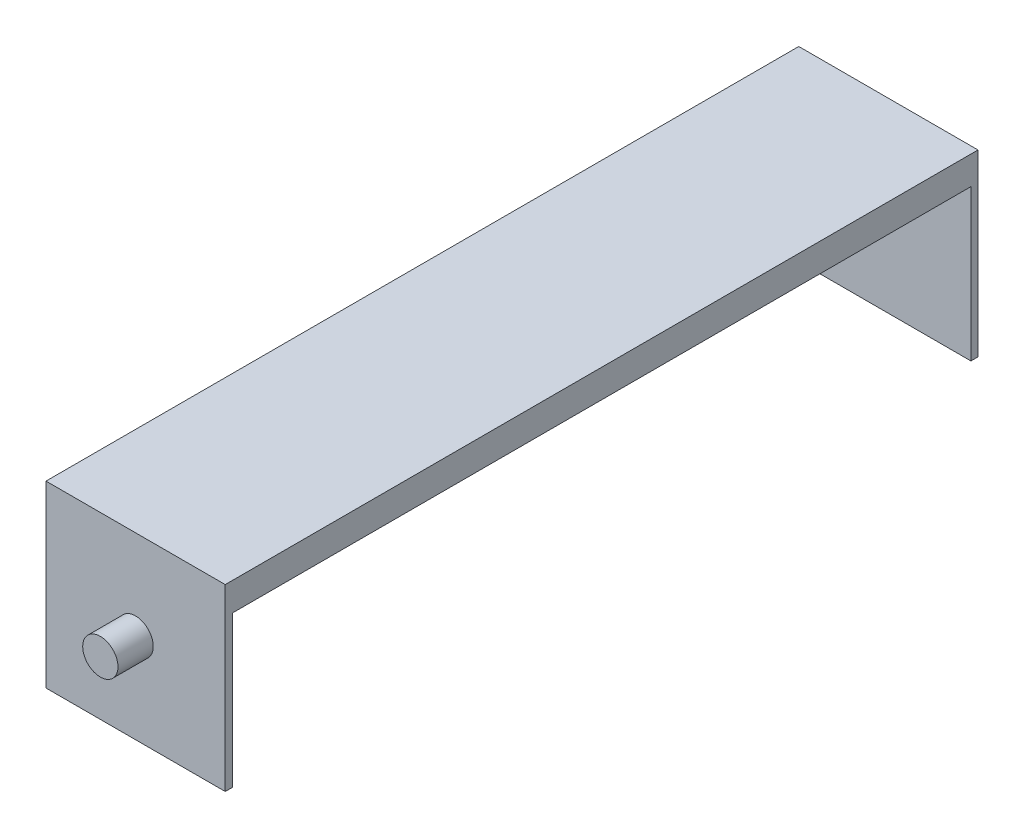
ISO-10303-21;
HEADER;
FILE_DESCRIPTION(('STEP AP214'),'2;1');
FILE_NAME('part.step','',(''),(''),'','','');
FILE_SCHEMA(('AUTOMOTIVE_DESIGN { 1 0 10303 214 1 1 1 1 }'));
ENDSEC;
DATA;
#1=APPLICATION_CONTEXT('core data for automotive mechanical design processes');
#2=APPLICATION_PROTOCOL_DEFINITION('international standard','automotive_design',2000,#1);
#3=PRODUCT_CONTEXT('',#1,'mechanical');
#4=PRODUCT('Part','Part','',(#3));
#5=PRODUCT_RELATED_PRODUCT_CATEGORY('part','',(#4));
#6=PRODUCT_DEFINITION_FORMATION('','',#4);
#7=PRODUCT_DEFINITION_CONTEXT('part definition',#1,'design');
#8=PRODUCT_DEFINITION('design','',#6,#7);
#9=PRODUCT_DEFINITION_SHAPE('','',#8);
#10=(LENGTH_UNIT() NAMED_UNIT(*) SI_UNIT(.MILLI.,.METRE.));
#11=(NAMED_UNIT(*) PLANE_ANGLE_UNIT() SI_UNIT($,.RADIAN.));
#12=(NAMED_UNIT(*) SI_UNIT($,.STERADIAN.) SOLID_ANGLE_UNIT());
#13=UNCERTAINTY_MEASURE_WITH_UNIT(LENGTH_MEASURE(1.E-05),#10,'distance_accuracy_value','');
#14=(GEOMETRIC_REPRESENTATION_CONTEXT(3) GLOBAL_UNCERTAINTY_ASSIGNED_CONTEXT((#13)) GLOBAL_UNIT_ASSIGNED_CONTEXT((#10,
#11,#12)) REPRESENTATION_CONTEXT('',''));
#15=CARTESIAN_POINT('',(0.,0.,0.));
#16=DIRECTION('',(0.,0.,1.));
#17=DIRECTION('',(1.,0.,0.));
#18=AXIS2_PLACEMENT_3D('',#15,#16,#17);
#19=CARTESIAN_POINT('',(-127.,-127.,533.4));
#20=DIRECTION('',(0.,1.,0.));
#21=DIRECTION('',(0.,0.,1.));
#22=AXIS2_PLACEMENT_3D('',#19,#20,#21);
#23=PLANE('',#22);
#24=DIRECTION('',(0.,0.,-1.));
#25=VECTOR('',#24,1.);
#26=CARTESIAN_POINT('',(127.,-127.,533.4));
#27=LINE('',#26,#25);
#28=CARTESIAN_POINT('',(127.,-127.,-523.4));
#29=VERTEX_POINT('',#28);
#30=CARTESIAN_POINT('',(127.,-127.,-533.4));
#31=VERTEX_POINT('',#30);
#32=EDGE_CURVE('E86',#29,#31,#27,.T.);
#33=ORIENTED_EDGE('',*,*,#32,.F.);
#34=DIRECTION('',(-1.,0.,0.));
#35=VECTOR('',#34,1.);
#36=CARTESIAN_POINT('',(-127.,-127.,-523.4));
#37=LINE('',#36,#35);
#38=CARTESIAN_POINT('',(-127.,-127.,-523.4));
#39=VERTEX_POINT('',#38);
#40=EDGE_CURVE('E11',#29,#39,#37,.T.);
#41=ORIENTED_EDGE('',*,*,#40,.T.);
#42=DIRECTION('',(0.,0.,-1.));
#43=VECTOR('',#42,1.);
#44=CARTESIAN_POINT('',(-127.,-127.,533.4));
#45=LINE('',#44,#43);
#46=CARTESIAN_POINT('',(-127.,-127.,-533.4));
#47=VERTEX_POINT('',#46);
#48=EDGE_CURVE('E163',#39,#47,#45,.T.);
#49=ORIENTED_EDGE('',*,*,#48,.T.);
#50=DIRECTION('',(1.,0.,0.));
#51=VECTOR('',#50,1.);
#52=CARTESIAN_POINT('',(-127.,-127.,-533.4));
#53=LINE('',#52,#51);
#54=EDGE_CURVE('E149',#47,#31,#53,.T.);
#55=ORIENTED_EDGE('',*,*,#54,.T.);
#56=EDGE_LOOP('',(#33,#41,#49,#55));
#57=FACE_BOUND('',#56,.T.);
#58=ADVANCED_FACE('F40',(#57),#23,.F.);
#59=CARTESIAN_POINT('',(127.,-127.,533.4));
#60=DIRECTION('',(-1.,0.,0.));
#61=DIRECTION('',(0.,0.,1.));
#62=AXIS2_PLACEMENT_3D('',#59,#60,#61);
#63=PLANE('',#62);
#64=DIRECTION('',(0.,0.,1.));
#65=VECTOR('',#64,1.);
#66=CARTESIAN_POINT('',(127.,87.,523.4));
#67=LINE('',#66,#65);
#68=CARTESIAN_POINT('',(127.,87.,-523.4));
#69=VERTEX_POINT('',#68);
#70=CARTESIAN_POINT('',(127.,87.,523.4));
#71=VERTEX_POINT('',#70);
#72=EDGE_CURVE('E121',#69,#71,#67,.T.);
#73=ORIENTED_EDGE('',*,*,#72,.F.);
#74=DIRECTION('',(0.,1.,0.));
#75=VECTOR('',#74,1.);
#76=CARTESIAN_POINT('',(127.,87.,-523.4));
#77=LINE('',#76,#75);
#78=EDGE_CURVE('E115',#29,#69,#77,.T.);
#79=ORIENTED_EDGE('',*,*,#78,.F.);
#80=ORIENTED_EDGE('',*,*,#32,.T.);
#81=DIRECTION('',(0.,1.,0.));
#82=VECTOR('',#81,1.);
#83=CARTESIAN_POINT('',(127.,-127.,-533.4));
#84=LINE('',#83,#82);
#85=CARTESIAN_POINT('',(127.,127.,-533.4));
#86=VERTEX_POINT('',#85);
#87=EDGE_CURVE('E146',#31,#86,#84,.T.);
#88=ORIENTED_EDGE('',*,*,#87,.T.);
#89=DIRECTION('',(0.,0.,-1.));
#90=VECTOR('',#89,1.);
#91=CARTESIAN_POINT('',(127.,127.,533.4));
#92=LINE('',#91,#90);
#93=CARTESIAN_POINT('',(127.,127.,533.4));
#94=VERTEX_POINT('',#93);
#95=EDGE_CURVE('E170',#94,#86,#92,.T.);
#96=ORIENTED_EDGE('',*,*,#95,.F.);
#97=DIRECTION('',(0.,1.,0.));
#98=VECTOR('',#97,1.);
#99=CARTESIAN_POINT('',(127.,-127.,533.4));
#100=LINE('',#99,#98);
#101=CARTESIAN_POINT('',(127.,-127.,533.4));
#102=VERTEX_POINT('',#101);
#103=EDGE_CURVE('E147',#102,#94,#100,.T.);
#104=ORIENTED_EDGE('',*,*,#103,.F.);
#105=CARTESIAN_POINT('',(127.,-127.,523.4));
#106=VERTEX_POINT('',#105);
#107=EDGE_CURVE('E161',#102,#106,#27,.T.);
#108=ORIENTED_EDGE('',*,*,#107,.T.);
#109=DIRECTION('',(0.,-1.,0.));
#110=VECTOR('',#109,1.);
#111=CARTESIAN_POINT('',(127.,87.,523.4));
#112=LINE('',#111,#110);
#113=EDGE_CURVE('E55',#71,#106,#112,.T.);
#114=ORIENTED_EDGE('',*,*,#113,.F.);
#115=EDGE_LOOP('',(#73,#79,#80,#88,#96,#104,#108,#114));
#116=FACE_BOUND('',#115,.T.);
#117=ADVANCED_FACE('F42',(#116),#63,.F.);
#118=CARTESIAN_POINT('',(-127.,127.,533.4));
#119=DIRECTION('',(0.,-1.,0.));
#120=DIRECTION('',(0.,0.,-1.));
#121=AXIS2_PLACEMENT_3D('',#118,#119,#120);
#122=PLANE('',#121);
#123=DIRECTION('',(-1.,0.,0.));
#124=VECTOR('',#123,1.);
#125=CARTESIAN_POINT('',(-127.,127.,-533.4));
#126=LINE('',#125,#124);
#127=CARTESIAN_POINT('',(-127.,127.,-533.4));
#128=VERTEX_POINT('',#127);
#129=EDGE_CURVE('E155',#86,#128,#126,.T.);
#130=ORIENTED_EDGE('',*,*,#129,.T.);
#131=DIRECTION('',(0.,0.,-1.));
#132=VECTOR('',#131,1.);
#133=CARTESIAN_POINT('',(-127.,127.,533.4));
#134=LINE('',#133,#132);
#135=CARTESIAN_POINT('',(-127.,127.,533.4));
#136=VERTEX_POINT('',#135);
#137=EDGE_CURVE('E167',#136,#128,#134,.T.);
#138=ORIENTED_EDGE('',*,*,#137,.F.);
#139=DIRECTION('',(-1.,0.,0.));
#140=VECTOR('',#139,1.);
#141=CARTESIAN_POINT('',(-127.,127.,533.4));
#142=LINE('',#141,#140);
#143=EDGE_CURVE('E94',#94,#136,#142,.T.);
#144=ORIENTED_EDGE('',*,*,#143,.F.);
#145=ORIENTED_EDGE('',*,*,#95,.T.);
#146=EDGE_LOOP('',(#130,#138,#144,#145));
#147=FACE_BOUND('',#146,.T.);
#148=ADVANCED_FACE('F185',(#147),#122,.F.);
#149=CARTESIAN_POINT('',(-127.,-127.,533.4));
#150=DIRECTION('',(1.,0.,0.));
#151=DIRECTION('',(0.,0.,-1.));
#152=AXIS2_PLACEMENT_3D('',#149,#150,#151);
#153=PLANE('',#152);
#154=ORIENTED_EDGE('',*,*,#48,.F.);
#155=DIRECTION('',(0.,-1.,0.));
#156=VECTOR('',#155,1.);
#157=CARTESIAN_POINT('',(-127.,87.,-523.4));
#158=LINE('',#157,#156);
#159=CARTESIAN_POINT('',(-127.,87.,-523.4));
#160=VERTEX_POINT('',#159);
#161=EDGE_CURVE('E140',#160,#39,#158,.T.);
#162=ORIENTED_EDGE('',*,*,#161,.F.);
#163=DIRECTION('',(0.,0.,-1.));
#164=VECTOR('',#163,1.);
#165=CARTESIAN_POINT('',(-127.,87.,523.4));
#166=LINE('',#165,#164);
#167=CARTESIAN_POINT('',(-127.,87.,523.4));
#168=VERTEX_POINT('',#167);
#169=EDGE_CURVE('E128',#168,#160,#166,.T.);
#170=ORIENTED_EDGE('',*,*,#169,.F.);
#171=DIRECTION('',(0.,1.,0.));
#172=VECTOR('',#171,1.);
#173=CARTESIAN_POINT('',(-127.,87.,523.4));
#174=LINE('',#173,#172);
#175=CARTESIAN_POINT('',(-127.,-127.,523.4));
#176=VERTEX_POINT('',#175);
#177=EDGE_CURVE('E136',#176,#168,#174,.T.);
#178=ORIENTED_EDGE('',*,*,#177,.F.);
#179=CARTESIAN_POINT('',(-127.,-127.,533.4));
#180=VERTEX_POINT('',#179);
#181=EDGE_CURVE('E164',#180,#176,#45,.T.);
#182=ORIENTED_EDGE('',*,*,#181,.F.);
#183=DIRECTION('',(0.,-1.,0.));
#184=VECTOR('',#183,1.);
#185=CARTESIAN_POINT('',(-127.,-127.,533.4));
#186=LINE('',#185,#184);
#187=EDGE_CURVE('E151',#136,#180,#186,.T.);
#188=ORIENTED_EDGE('',*,*,#187,.F.);
#189=ORIENTED_EDGE('',*,*,#137,.T.);
#190=DIRECTION('',(0.,-1.,0.));
#191=VECTOR('',#190,1.);
#192=CARTESIAN_POINT('',(-127.,-127.,-533.4));
#193=LINE('',#192,#191);
#194=EDGE_CURVE('E157',#128,#47,#193,.T.);
#195=ORIENTED_EDGE('',*,*,#194,.T.);
#196=EDGE_LOOP('',(#154,#162,#170,#178,#182,#188,#189,#195));
#197=FACE_BOUND('',#196,.T.);
#198=ADVANCED_FACE('F189',(#197),#153,.F.);
#199=ORIENTED_EDGE('',*,*,#181,.T.);
#200=DIRECTION('',(1.,0.,0.));
#201=VECTOR('',#200,1.);
#202=CARTESIAN_POINT('',(-127.,-127.,523.4));
#203=LINE('',#202,#201);
#204=EDGE_CURVE('E48',#176,#106,#203,.T.);
#205=ORIENTED_EDGE('',*,*,#204,.T.);
#206=ORIENTED_EDGE('',*,*,#107,.F.);
#207=DIRECTION('',(1.,0.,0.));
#208=VECTOR('',#207,1.);
#209=CARTESIAN_POINT('',(-127.,-127.,533.4));
#210=LINE('',#209,#208);
#211=EDGE_CURVE('E64',#180,#102,#210,.T.);
#212=ORIENTED_EDGE('',*,*,#211,.F.);
#213=EDGE_LOOP('',(#199,#205,#206,#212));
#214=FACE_BOUND('',#213,.T.);
#215=ADVANCED_FACE('F178',(#214),#23,.F.);
#216=CARTESIAN_POINT('',(0.,0.,533.4));
#217=DIRECTION('',(0.,0.,-1.));
#218=DIRECTION('',(-1.,0.,0.));
#219=AXIS2_PLACEMENT_3D('',#216,#217,#218);
#220=PLANE('',#219);
#221=CARTESIAN_POINT('',(0.,0.,533.4));
#222=DIRECTION('',(0.,0.,-1.));
#223=DIRECTION('',(-1.,0.,0.));
#224=AXIS2_PLACEMENT_3D('',#221,#222,#223);
#225=CIRCLE('',#224,25.);
#226=CARTESIAN_POINT('',(-25.,0.,533.4));
#227=VERTEX_POINT('',#226);
#228=EDGE_CURVE('E172',#227,#227,#225,.F.);
#229=ORIENTED_EDGE('',*,*,#228,.F.);
#230=EDGE_LOOP('',(#229));
#231=FACE_BOUND('',#230,.T.);
#232=ORIENTED_EDGE('',*,*,#103,.T.);
#233=ORIENTED_EDGE('',*,*,#143,.T.);
#234=ORIENTED_EDGE('',*,*,#187,.T.);
#235=ORIENTED_EDGE('',*,*,#211,.T.);
#236=EDGE_LOOP('',(#232,#233,#234,#235));
#237=FACE_BOUND('',#236,.T.);
#238=ADVANCED_FACE('F183',(#231,#237),#220,.F.);
#239=CARTESIAN_POINT('',(0.,0.,-533.4));
#240=DIRECTION('',(0.,0.,-1.));
#241=DIRECTION('',(-1.,0.,0.));
#242=AXIS2_PLACEMENT_3D('',#239,#240,#241);
#243=PLANE('',#242);
#244=CARTESIAN_POINT('',(0.,0.,-533.4));
#245=DIRECTION('',(0.,0.,-1.));
#246=DIRECTION('',(-1.,0.,0.));
#247=AXIS2_PLACEMENT_3D('',#244,#245,#246);
#248=CIRCLE('',#247,25.);
#249=CARTESIAN_POINT('',(-25.,0.,-533.4));
#250=VERTEX_POINT('',#249);
#251=EDGE_CURVE('E175',#250,#250,#248,.T.);
#252=ORIENTED_EDGE('',*,*,#251,.F.);
#253=EDGE_LOOP('',(#252));
#254=FACE_BOUND('',#253,.T.);
#255=ORIENTED_EDGE('',*,*,#87,.F.);
#256=ORIENTED_EDGE('',*,*,#54,.F.);
#257=ORIENTED_EDGE('',*,*,#194,.F.);
#258=ORIENTED_EDGE('',*,*,#129,.F.);
#259=EDGE_LOOP('',(#255,#256,#257,#258));
#260=FACE_BOUND('',#259,.T.);
#261=ADVANCED_FACE('F195',(#254,#260),#243,.T.);
#262=CARTESIAN_POINT('',(0.,0.,583.4));
#263=DIRECTION('',(0.,0.,-1.));
#264=DIRECTION('',(-1.,0.,0.));
#265=AXIS2_PLACEMENT_3D('',#262,#263,#264);
#266=CYLINDRICAL_SURFACE('',#265,25.);
#267=CARTESIAN_POINT('',(0.,0.,583.4));
#268=DIRECTION('',(0.,0.,1.));
#269=DIRECTION('',(1.,0.,0.));
#270=AXIS2_PLACEMENT_3D('',#267,#268,#269);
#271=CIRCLE('',#270,25.);
#272=CARTESIAN_POINT('',(25.,0.,583.4));
#273=VERTEX_POINT('',#272);
#274=EDGE_CURVE('E143',#273,#273,#271,.T.);
#275=ORIENTED_EDGE('',*,*,#274,.F.);
#276=EDGE_LOOP('',(#275));
#277=FACE_BOUND('',#276,.T.);
#278=ORIENTED_EDGE('',*,*,#228,.T.);
#279=EDGE_LOOP('',(#278));
#280=FACE_BOUND('',#279,.T.);
#281=ADVANCED_FACE('F197',(#277,#280),#266,.T.);
#282=CARTESIAN_POINT('',(0.,0.,583.4));
#283=DIRECTION('',(0.,0.,1.));
#284=DIRECTION('',(1.,0.,0.));
#285=AXIS2_PLACEMENT_3D('',#282,#283,#284);
#286=PLANE('',#285);
#287=ORIENTED_EDGE('',*,*,#274,.T.);
#288=EDGE_LOOP('',(#287));
#289=FACE_BOUND('',#288,.T.);
#290=ADVANCED_FACE('F204',(#289),#286,.T.);
#291=CARTESIAN_POINT('',(0.,0.,-583.4));
#292=DIRECTION('',(0.,0.,1.));
#293=DIRECTION('',(1.,0.,0.));
#294=AXIS2_PLACEMENT_3D('',#291,#292,#293);
#295=CYLINDRICAL_SURFACE('',#294,25.);
#296=CARTESIAN_POINT('',(0.,0.,-583.4));
#297=DIRECTION('',(0.,0.,1.));
#298=DIRECTION('',(1.,0.,0.));
#299=AXIS2_PLACEMENT_3D('',#296,#297,#298);
#300=CIRCLE('',#299,25.);
#301=CARTESIAN_POINT('',(25.,0.,-583.4));
#302=VERTEX_POINT('',#301);
#303=EDGE_CURVE('E139',#302,#302,#300,.T.);
#304=ORIENTED_EDGE('',*,*,#303,.T.);
#305=EDGE_LOOP('',(#304));
#306=FACE_BOUND('',#305,.T.);
#307=ORIENTED_EDGE('',*,*,#251,.T.);
#308=EDGE_LOOP('',(#307));
#309=FACE_BOUND('',#308,.T.);
#310=ADVANCED_FACE('F257',(#306,#309),#295,.T.);
#311=CARTESIAN_POINT('',(0.,0.,-583.4));
#312=DIRECTION('',(0.,0.,-1.));
#313=DIRECTION('',(1.,0.,0.));
#314=AXIS2_PLACEMENT_3D('',#311,#312,#313);
#315=PLANE('',#314);
#316=ORIENTED_EDGE('',*,*,#303,.F.);
#317=EDGE_LOOP('',(#316));
#318=FACE_BOUND('',#317,.T.);
#319=ADVANCED_FACE('F270',(#318),#315,.T.);
#320=CARTESIAN_POINT('',(-1207.47272924202,87.,-523.4));
#321=DIRECTION('',(0.,0.,-1.));
#322=DIRECTION('',(0.,1.,0.));
#323=AXIS2_PLACEMENT_3D('',#320,#321,#322);
#324=PLANE('',#323);
#325=ORIENTED_EDGE('',*,*,#78,.T.);
#326=DIRECTION('',(1.,0.,0.));
#327=VECTOR('',#326,1.);
#328=CARTESIAN_POINT('',(-1207.47272924202,87.,-523.4));
#329=LINE('',#328,#327);
#330=EDGE_CURVE('E118',#160,#69,#329,.T.);
#331=ORIENTED_EDGE('',*,*,#330,.F.);
#332=ORIENTED_EDGE('',*,*,#161,.T.);
#333=ORIENTED_EDGE('',*,*,#40,.F.);
#334=EDGE_LOOP('',(#325,#331,#332,#333));
#335=FACE_BOUND('',#334,.T.);
#336=ADVANCED_FACE('F117',(#335),#324,.F.);
#337=CARTESIAN_POINT('',(-1207.47272924202,87.,523.4));
#338=DIRECTION('',(0.,0.,1.));
#339=DIRECTION('',(1.,0.,0.));
#340=AXIS2_PLACEMENT_3D('',#337,#338,#339);
#341=PLANE('',#340);
#342=ORIENTED_EDGE('',*,*,#177,.T.);
#343=DIRECTION('',(1.,0.,0.));
#344=VECTOR('',#343,1.);
#345=CARTESIAN_POINT('',(-1207.47272924202,87.,523.4));
#346=LINE('',#345,#344);
#347=EDGE_CURVE('E129',#168,#71,#346,.T.);
#348=ORIENTED_EDGE('',*,*,#347,.T.);
#349=ORIENTED_EDGE('',*,*,#113,.T.);
#350=ORIENTED_EDGE('',*,*,#204,.F.);
#351=EDGE_LOOP('',(#342,#348,#349,#350));
#352=FACE_BOUND('',#351,.T.);
#353=ADVANCED_FACE('F292',(#352),#341,.F.);
#354=CARTESIAN_POINT('',(-1207.47272924202,87.,523.4));
#355=DIRECTION('',(0.,1.,0.));
#356=DIRECTION('',(0.,0.,1.));
#357=AXIS2_PLACEMENT_3D('',#354,#355,#356);
#358=PLANE('',#357);
#359=ORIENTED_EDGE('',*,*,#169,.T.);
#360=ORIENTED_EDGE('',*,*,#330,.T.);
#361=ORIENTED_EDGE('',*,*,#72,.T.);
#362=ORIENTED_EDGE('',*,*,#347,.F.);
#363=EDGE_LOOP('',(#359,#360,#361,#362));
#364=FACE_BOUND('',#363,.T.);
#365=ADVANCED_FACE('F125',(#364),#358,.F.);
#366=CLOSED_SHELL('',(#58,#117,#148,#198,#215,#238,#261,#281,#290,#310,#319,#336,#353,#365));
#367=MANIFOLD_SOLID_BREP('B2',#366);
#368=ADVANCED_BREP_SHAPE_REPRESENTATION('',(#18,#367),#14);
#369=SHAPE_DEFINITION_REPRESENTATION(#9,#368);
ENDSEC;
END-ISO-10303-21;
